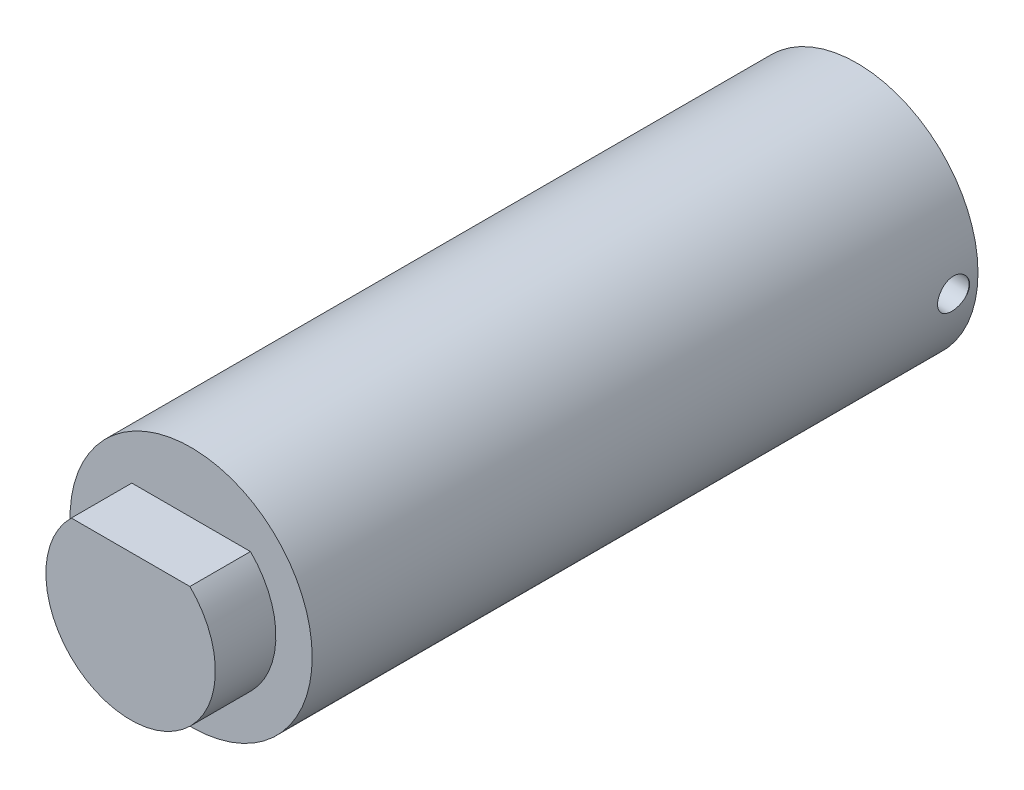
ISO-10303-21;
HEADER;
FILE_DESCRIPTION(('STEP AP214'),'2;1');
FILE_NAME('part.step','',(''),(''),'','','');
FILE_SCHEMA(('AUTOMOTIVE_DESIGN { 1 0 10303 214 1 1 1 1 }'));
ENDSEC;
DATA;
#1=APPLICATION_CONTEXT('core data for automotive mechanical design processes');
#2=APPLICATION_PROTOCOL_DEFINITION('international standard','automotive_design',2000,#1);
#3=PRODUCT_CONTEXT('',#1,'mechanical');
#4=PRODUCT('Part','Part','',(#3));
#5=PRODUCT_RELATED_PRODUCT_CATEGORY('part','',(#4));
#6=PRODUCT_DEFINITION_FORMATION('','',#4);
#7=PRODUCT_DEFINITION_CONTEXT('part definition',#1,'design');
#8=PRODUCT_DEFINITION('design','',#6,#7);
#9=PRODUCT_DEFINITION_SHAPE('','',#8);
#10=(LENGTH_UNIT() NAMED_UNIT(*) SI_UNIT(.MILLI.,.METRE.));
#11=(NAMED_UNIT(*) PLANE_ANGLE_UNIT() SI_UNIT($,.RADIAN.));
#12=(NAMED_UNIT(*) SI_UNIT($,.STERADIAN.) SOLID_ANGLE_UNIT());
#13=UNCERTAINTY_MEASURE_WITH_UNIT(LENGTH_MEASURE(1.E-05),#10,'distance_accuracy_value','');
#14=(GEOMETRIC_REPRESENTATION_CONTEXT(3) GLOBAL_UNCERTAINTY_ASSIGNED_CONTEXT((#13)) GLOBAL_UNIT_ASSIGNED_CONTEXT((#10,
#11,#12)) REPRESENTATION_CONTEXT('',''));
#15=CARTESIAN_POINT('',(0.,0.,0.));
#16=DIRECTION('',(0.,0.,1.));
#17=DIRECTION('',(1.,0.,0.));
#18=AXIS2_PLACEMENT_3D('',#15,#16,#17);
#19=CARTESIAN_POINT('',(0.,0.,60.));
#20=DIRECTION('',(0.,0.,-1.));
#21=DIRECTION('',(-1.,0.,0.));
#22=AXIS2_PLACEMENT_3D('',#19,#20,#21);
#23=CYLINDRICAL_SURFACE('',#22,10.);
#24=CARTESIAN_POINT('',(-10.,0.,3.17520873643316));
#25=CARTESIAN_POINT('',(-9.99999941187946,-0.0662433170421983,3.14392640580855));
#26=CARTESIAN_POINT('',(-9.99933636283552,-0.129891366730712,3.10703901996945));
#27=CARTESIAN_POINT('',(-9.99705258401728,-0.25014696655455,3.02310705172579));
#28=CARTESIAN_POINT('',(-9.99543078797547,-0.306746592828572,2.97605119751558));
#29=CARTESIAN_POINT('',(-9.99167795365727,-0.411225653924768,2.87314766504507));
#30=CARTESIAN_POINT('',(-9.98954716880633,-0.459109407538856,2.8173043667585));
#31=CARTESIAN_POINT('',(-9.9852408485209,-0.544804762138996,2.69838257042104));
#32=CARTESIAN_POINT('',(-9.98306532390359,-0.582618767652236,2.63530580478564));
#33=CARTESIAN_POINT('',(-9.97909450596949,-0.647086451779091,2.50367065039214));
#34=CARTESIAN_POINT('',(-9.97729921622944,-0.673740025412321,2.43511221007799));
#35=CARTESIAN_POINT('',(-9.97442179253287,-0.715082786142368,2.29446157509235));
#36=CARTESIAN_POINT('',(-9.97333964734461,-0.729772161671254,2.22236943609436));
#37=CARTESIAN_POINT('',(-9.9720886889472,-0.74667237446653,2.07726328567874));
#38=CARTESIAN_POINT('',(-9.97191327028684,-0.74897346481107,2.00425983647181));
#39=CARTESIAN_POINT('',(-9.97248885100967,-0.741269479901278,1.85891054708878));
#40=CARTESIAN_POINT('',(-9.97323982712879,-0.731264713677592,1.78656469044486));
#41=CARTESIAN_POINT('',(-9.97553057154206,-0.699315451498621,1.64485848382866));
#42=CARTESIAN_POINT('',(-9.97706739926419,-0.677415447368808,1.57548804163908));
#43=CARTESIAN_POINT('',(-9.980652733918,-0.622356491162161,1.44138400912855));
#44=CARTESIAN_POINT('',(-9.9827012592438,-0.589197134327282,1.37665058560329));
#45=CARTESIAN_POINT('',(-9.98693997538907,-0.512360373952198,1.25325476394668));
#46=CARTESIAN_POINT('',(-9.98913090302228,-0.468624448082806,1.19462883678929));
#47=CARTESIAN_POINT('',(-9.99319590400158,-0.371979727520631,1.08548556412126));
#48=CARTESIAN_POINT('',(-9.99506996371703,-0.319070538422035,1.03496856743521));
#49=CARTESIAN_POINT('',(-9.99805714105313,-0.205208603724033,0.943158287671727));
#50=CARTESIAN_POINT('',(-9.99916545816821,-0.144207921815275,0.901924266967281));
#51=CARTESIAN_POINT('',(-10.0001916727002,-0.016149036171561,0.830261696801887));
#52=CARTESIAN_POINT('',(-10.0001095946572,0.0509090426613417,0.799832924603108));
#53=CARTESIAN_POINT('',(-9.99845178406014,0.188971851173674,0.750740525859519));
#54=CARTESIAN_POINT('',(-9.99688029401258,0.259964831890185,0.732043732769723));
#55=CARTESIAN_POINT('',(-9.9920945148386,0.404027707008825,0.706838485676164));
#56=CARTESIAN_POINT('',(-9.98888030897354,0.477097495970263,0.700329414013289));
#57=CARTESIAN_POINT('',(-9.98086012741732,0.62266028780857,0.699697342998845));
#58=CARTESIAN_POINT('',(-9.97606607059783,0.695153568720002,0.705483314808619));
#59=CARTESIAN_POINT('',(-9.96507991156896,0.838044695741493,0.729083043309526));
#60=CARTESIAN_POINT('',(-9.95888781293385,0.908442547208252,0.746896769250474));
#61=CARTESIAN_POINT('',(-9.94547181997115,1.04513560609381,0.794015499947084));
#62=CARTESIAN_POINT('',(-9.93824842229496,1.1114327664175,0.823314985197033));
#63=CARTESIAN_POINT('',(-9.92325950839722,1.2381422421821,0.892564868690224));
#64=CARTESIAN_POINT('',(-9.91549396648841,1.29855427845558,0.932515771859785));
#65=CARTESIAN_POINT('',(-9.89994125045513,1.41226246391155,1.02227195859742));
#66=CARTESIAN_POINT('',(-9.89215431838212,1.46550467037847,1.0721456303354));
#67=CARTESIAN_POINT('',(-9.87723447819751,1.56290524462446,1.18017566868471));
#68=CARTESIAN_POINT('',(-9.87010158764625,1.60706336854498,1.23833225757672));
#69=CARTESIAN_POINT('',(-9.85705834113824,1.68522477366879,1.36155128450857));
#70=CARTESIAN_POINT('',(-9.85115274000829,1.71918877791369,1.42663915636274));
#71=CARTESIAN_POINT('',(-9.84111199134905,1.7757661227198,1.56170170513952));
#72=CARTESIAN_POINT('',(-9.83697677320621,1.79837991600205,1.63167618702514));
#73=CARTESIAN_POINT('',(-9.83086315027874,1.83150613190975,1.77411550995424));
#74=CARTESIAN_POINT('',(-9.82887293436511,1.84208484200396,1.84656442333078));
#75=CARTESIAN_POINT('',(-9.82718791279291,1.85105365856801,1.99223773074678));
#76=CARTESIAN_POINT('',(-9.82749300806435,1.84944429109842,2.06546209118025));
#77=CARTESIAN_POINT('',(-9.83036155412294,1.83413468037774,2.21012194562162));
#78=CARTESIAN_POINT('',(-9.8329108022337,1.82051047504413,2.28156578899764));
#79=CARTESIAN_POINT('',(-9.84002220789699,1.78167036264875,2.4211239063328));
#80=CARTESIAN_POINT('',(-9.84458440862427,1.75645420695688,2.48923810884143));
#81=CARTESIAN_POINT('',(-9.85534107397195,1.69505791958804,2.62042575402136));
#82=CARTESIAN_POINT('',(-9.86154010941462,1.65884704228475,2.68348442617049));
#83=CARTESIAN_POINT('',(-9.87503987534306,1.57649073116797,2.80261001964597));
#84=CARTESIAN_POINT('',(-9.88234066221382,1.53034478885009,2.85867658286459));
#85=CARTESIAN_POINT('',(-9.89750570179512,1.42899261504033,2.96266905289966));
#86=CARTESIAN_POINT('',(-9.90537378282028,1.37372078756001,3.01053049387105));
#87=CARTESIAN_POINT('',(-9.92100194573648,1.25588478622615,3.0962468848199));
#88=CARTESIAN_POINT('',(-9.92876203067096,1.19332081833903,3.13410211732397));
#89=CARTESIAN_POINT('',(-9.94360135183192,1.06259885889872,3.1987381783688));
#90=CARTESIAN_POINT('',(-9.95068027316997,0.994438306882709,3.22551390376969));
#91=CARTESIAN_POINT('',(-9.96367628934014,0.854453983079347,3.26717818606488));
#92=CARTESIAN_POINT('',(-9.96959319908839,0.782629630017385,3.2820648504394));
#93=CARTESIAN_POINT('',(-9.97989605300074,0.637890977675351,3.2994380912197));
#94=CARTESIAN_POINT('',(-9.98429207943078,0.564987333358729,3.30200783990822));
#95=CARTESIAN_POINT('',(-9.99145036231589,0.419753202285472,3.29488952103383));
#96=CARTESIAN_POINT('',(-9.99421433206001,0.347422193397614,3.28521434153661));
#97=CARTESIAN_POINT('',(-9.99749692886973,0.228782763527017,3.25909579296068));
#98=CARTESIAN_POINT('',(-9.9984550448465,0.181739365997311,3.24592474906565));
#99=CARTESIAN_POINT('',(-9.99970677542979,0.0894133784123451,3.21440123685603));
#100=CARTESIAN_POINT('',(-10.0000003918013,0.0441307836804142,3.19604878230427));
#101=CARTESIAN_POINT('',(-10.,0.,3.17520873643316));
#102=B_SPLINE_CURVE_WITH_KNOTS('',3,(#24,#25,#26,#27,#28,#29,#30,#31,#32,#33,#34,#35,#36,#37,
#38,#39,#40,#41,#42,#43,#44,#45,#46,#47,#48,#49,#50,#51,#52,#53,#54,#55,#56,#57,#58,#59,#60,#61,
#62,#63,#64,#65,#66,#67,#68,#69,#70,#71,#72,#73,#74,#75,#76,#77,#78,#79,#80,#81,#82,#83,#84,#85,
#86,#87,#88,#89,#90,#91,#92,#93,#94,#95,#96,#97,#98,#99,#100,#101),.UNSPECIFIED.,.T.,.F.,(4,2,2,
2,2,2,2,2,2,2,2,2,2,2,2,2,2,2,2,2,2,2,2,2,2,2,2,2,2,2,2,2,2,2,2,2,2,2,4),(0.,0.219596322308999,
0.439437328665767,0.659169103542997,0.878848362135122,1.0985296870895,1.31820755207049,
1.53628279777127,1.75435256717238,1.97161225000845,2.18887974385446,2.40737809558718,
2.62588584401966,2.84575130120144,3.06561222584533,3.28484876523283,3.50407419367453,
3.72168219977831,3.93928964954707,4.15679265553784,4.37430597400775,4.59337385055163,
4.81244760711763,5.03235490715652,5.25225343514898,5.47093483994062,5.68960680608162,
5.90690472240653,6.124207299666,6.34212322728039,6.56005031109348,6.77961808697564,
6.99917966267079,7.21884225455521,7.43853980571747,7.65675169764788,7.8747341074824,
8.02102786163645,8.16732122720961),.UNSPECIFIED.);
#103=CARTESIAN_POINT('',(-10.,0.,3.17520873643316));
#104=VERTEX_POINT('',#103);
#105=EDGE_CURVE('E54',#104,#104,#102,.T.);
#106=ORIENTED_EDGE('',*,*,#105,.T.);
#107=EDGE_LOOP('',(#106));
#108=FACE_BOUND('',#107,.T.);
#109=CARTESIAN_POINT('',(9.92030790761923,-1.25995675244324,0.908842357860262));
#110=CARTESIAN_POINT('',(9.91642507020085,-1.29053186759439,0.928753300924202));
#111=CARTESIAN_POINT('',(9.91250738426814,-1.32024298393703,0.949951277393107));
#112=CARTESIAN_POINT('',(9.90467618166283,-1.37776285655369,0.994785506428262));
#113=CARTESIAN_POINT('',(9.90076266478702,-1.40557171015072,1.01842163409913));
#114=CARTESIAN_POINT('',(9.88914899987093,-1.48581572305187,1.09271998197902));
#115=CARTESIAN_POINT('',(9.88156486765142,-1.53515172667273,1.1468266059941));
#116=CARTESIAN_POINT('',(9.86734169470781,-1.62407121613566,1.26264234426558));
#117=CARTESIAN_POINT('',(9.86070310644059,-1.66365003959749,1.32435507198556));
#118=CARTESIAN_POINT('',(9.84893799556353,-1.73194234291115,1.4536474959404));
#119=CARTESIAN_POINT('',(9.84381103686963,-1.7606589570366,1.52122549283078));
#120=CARTESIAN_POINT('',(9.83553132166988,-1.80634038595019,1.66014112767477));
#121=CARTESIAN_POINT('',(9.83237293470389,-1.82333873196454,1.73146740447137));
#122=CARTESIAN_POINT('',(9.82828981330383,-1.84522233662178,1.87603167776489));
#123=CARTESIAN_POINT('',(9.82736543244546,-1.85010567782845,1.94926997502306));
#124=CARTESIAN_POINT('',(9.82783349813002,-1.84761727159083,2.09498524217048));
#125=CARTESIAN_POINT('',(9.82920883474485,-1.84033602915424,2.16746383310502));
#126=CARTESIAN_POINT('',(9.83412030770654,-1.8139063053651,2.31013476605431));
#127=CARTESIAN_POINT('',(9.83765608286683,-1.79475980766277,2.38032748815968));
#128=CARTESIAN_POINT('',(9.8465775466889,-1.74514787687734,2.51647825860996));
#129=CARTESIAN_POINT('',(9.85196362054303,-1.71468008683702,2.58243542180649));
#130=CARTESIAN_POINT('',(9.86412488813292,-1.64327375250799,2.70828995485394));
#131=CARTESIAN_POINT('',(9.87090026856504,-1.60233380077672,2.76818650865694));
#132=CARTESIAN_POINT('',(9.88473693826456,-1.51452560316755,2.87605492114388));
#133=CARTESIAN_POINT('',(9.89173898811333,-1.46832934339026,2.92458349762));
#134=CARTESIAN_POINT('',(9.90597111922014,-1.36904171087645,3.01392546374391));
#135=CARTESIAN_POINT('',(9.91320117002783,-1.31595125595681,3.05473987859703));
#136=CARTESIAN_POINT('',(9.92030790761923,-1.25995675244324,3.09115764213974));
#137=B_SPLINE_CURVE_WITH_KNOTS('',3,(#109,#110,#111,#112,#113,#114,#115,#116,#117,#118,#119,
#120,#121,#122,#123,#124,#125,#126,#127,#128,#129,#130,#131,#132,#133,#134,#135,#136),
.UNSPECIFIED.,.F.,.F.,(4,2,2,2,2,2,2,2,2,2,2,2,2,4),(0.,0.110010231197419,0.220014829867564,
0.439727306736397,0.659544568607131,0.879298354075111,1.09842068568989,1.31757769548315,
1.53511141858782,1.75260878390323,1.970151454953,2.18772337878175,2.38903014774453,
2.59031014437327),.UNSPECIFIED.);
#138=CARTESIAN_POINT('',(9.92030790761922,-1.25995675244339,0.908842357860253));
#139=VERTEX_POINT('',#138);
#140=CARTESIAN_POINT('',(9.92030790761923,-1.25995675244324,3.09115764213974));
#141=VERTEX_POINT('',#140);
#142=EDGE_CURVE('E63',#139,#141,#137,.T.);
#143=ORIENTED_EDGE('',*,*,#142,.T.);
#144=CARTESIAN_POINT('',(9.84112162747085,-1.77547891631716,1.75729613212786));
#145=CARTESIAN_POINT('',(9.83870187839933,-1.78889589121932,1.83425561713675));
#146=CARTESIAN_POINT('',(9.83741411905284,-1.7959085214737,1.91242444344527));
#147=CARTESIAN_POINT('',(9.83722365538213,-1.796949460704,2.06891763227625));
#148=CARTESIAN_POINT('',(9.83832388427163,-1.79096180116094,2.14724206788276));
#149=CARTESIAN_POINT('',(9.84279330304227,-1.76623179888494,2.3009326282756));
#150=CARTESIAN_POINT('',(9.84613807838503,-1.74762667686533,2.37632144560045));
#151=CARTESIAN_POINT('',(9.85478807610367,-1.69816911762782,2.52283799536986));
#152=CARTESIAN_POINT('',(9.86009279138173,-1.66731984820108,2.59396682447971));
#153=CARTESIAN_POINT('',(9.87220110235642,-1.59405681019271,2.72974097468138));
#154=CARTESIAN_POINT('',(9.87900252549271,-1.55165978287671,2.79439549768758));
#155=CARTESIAN_POINT('',(9.89352134038225,-1.45621321657557,2.91520374531091));
#156=CARTESIAN_POINT('',(9.90123862741716,-1.40316489496258,2.9713584401167));
#157=CARTESIAN_POINT('',(9.91658597063835,-1.29012946443856,3.07097813765436));
#158=CARTESIAN_POINT('',(9.92420649624951,-1.23051879202062,3.11487100135254));
#159=CARTESIAN_POINT('',(9.93903972993441,-1.10431511515401,3.19119658952293));
#160=CARTESIAN_POINT('',(9.94625262432875,-1.0377253411091,3.22363458597399));
#161=CARTESIAN_POINT('',(9.9592746959458,-0.903923703741134,3.27400000848012));
#162=CARTESIAN_POINT('',(9.96514346099709,-0.837011388112895,3.29270827762781));
#163=CARTESIAN_POINT('',(9.97564386619167,-0.700844515015437,3.31800337070767));
#164=CARTESIAN_POINT('',(9.98027594408756,-0.631590796142899,3.32459448864724));
#165=CARTESIAN_POINT('',(9.98789148837806,-0.496372223723747,3.32535019699468));
#166=CARTESIAN_POINT('',(9.99094507566208,-0.430413854779419,3.32011240922813));
#167=CARTESIAN_POINT('',(9.99570305792089,-0.300268281763199,3.29864656670684));
#168=CARTESIAN_POINT('',(9.99740752693235,-0.236080980685557,3.28241911513165));
#169=CARTESIAN_POINT('',(9.99957253080034,-0.111465534423173,3.23968490274023));
#170=CARTESIAN_POINT('',(10.0000373163718,-0.051025239519756,3.21321362521997));
#171=CARTESIAN_POINT('',(9.99995792045217,0.0648285017142996,3.15093777751921));
#172=CARTESIAN_POINT('',(9.99941357438368,0.120241126545713,3.11513168575992));
#173=CARTESIAN_POINT('',(9.99757192121723,0.226999831423517,3.03364931033472));
#174=CARTESIAN_POINT('',(9.99624384121187,0.278076025955523,2.98762058584933));
#175=CARTESIAN_POINT('',(9.99317802130625,0.372318935942867,2.88809326205167));
#176=CARTESIAN_POINT('',(9.99144017205711,0.415483534677022,2.8345926703924));
#177=CARTESIAN_POINT('',(9.9878056576229,0.495418314301563,2.71816262367319));
#178=CARTESIAN_POINT('',(9.98590575007688,0.531642505192331,2.65485825993186));
#179=CARTESIAN_POINT('',(9.98241899037876,0.59352728784107,2.52327455116891));
#180=CARTESIAN_POINT('',(9.98083221503776,0.619185289393839,2.45499399110051));
#181=CARTESIAN_POINT('',(9.97818992287415,0.660438387851583,2.31179802666823));
#182=CARTESIAN_POINT('',(9.9771643243036,0.675477392244543,2.23672146373901));
#183=CARTESIAN_POINT('',(9.97595681753525,0.693082691719316,2.08511034451187));
#184=CARTESIAN_POINT('',(9.97577504016275,0.695647052746189,2.00857556397997));
#185=CARTESIAN_POINT('',(9.97629438038086,0.688161425625093,1.85433458898787));
#186=CARTESIAN_POINT('',(9.97701613229705,0.677816642580072,1.77664255444528));
#187=CARTESIAN_POINT('',(9.97924137663793,0.644222026038059,1.62410197776085));
#188=CARTESIAN_POINT('',(9.98074491837892,0.620971378416367,1.54925361532115));
#189=CARTESIAN_POINT('',(9.98422996123512,0.562150799536995,1.40482594517868));
#190=CARTESIAN_POINT('',(9.98621001823585,0.526617951073755,1.33523153656894));
#191=CARTESIAN_POINT('',(9.99022314208316,0.444009781669548,1.20325087510685));
#192=CARTESIAN_POINT('',(9.99225620335076,0.396935671156475,1.14086386736339));
#193=CARTESIAN_POINT('',(9.99580405041272,0.294042199992013,1.02728067832593));
#194=CARTESIAN_POINT('',(9.99733311487408,0.238544133080217,0.97579444238686));
#195=CARTESIAN_POINT('',(9.99946643218835,0.11923776744409,0.883534187824395));
#196=CARTESIAN_POINT('',(10.0000710478457,0.0554327395008185,0.842755971993138));
#197=CARTESIAN_POINT('',(9.99992007759185,-0.0746840802996298,0.77564294726257));
#198=CARTESIAN_POINT('',(9.99924172097778,-0.140632980555455,0.748604804346062));
#199=CARTESIAN_POINT('',(9.9964128854401,-0.276256540509083,0.706693806335169));
#200=CARTESIAN_POINT('',(9.99426303566891,-0.345929596172484,0.691815758026812));
#201=CARTESIAN_POINT('',(9.98856707840148,-0.482633611453888,0.67538678819662));
#202=CARTESIAN_POINT('',(9.98510969711876,-0.549581736678561,0.67310934236925));
#203=CARTESIAN_POINT('',(9.97688537501593,-0.682795129676097,0.68002287090702));
#204=CARTESIAN_POINT('',(9.97211862734318,-0.749060496669423,0.689212154498828));
#205=CARTESIAN_POINT('',(9.96161645105304,-0.877656236554694,0.718373795225498));
#206=CARTESIAN_POINT('',(9.95590261384801,-0.940039142685556,0.738123825701551));
#207=CARTESIAN_POINT('',(9.94377451420479,-1.06067328075615,0.78751485723312));
#208=CARTESIAN_POINT('',(9.93736020508511,-1.11892423690342,0.817156517766696));
#209=CARTESIAN_POINT('',(9.92404111271383,-1.23155244191704,0.886316771442836));
#210=CARTESIAN_POINT('',(9.91712746672659,-1.28576628089953,0.926099202600828));
#211=CARTESIAN_POINT('',(9.90344951403372,-1.38719614970874,1.01379566151615));
#212=CARTESIAN_POINT('',(9.89668527778588,-1.43440893554743,1.0617134369235));
#213=CARTESIAN_POINT('',(9.88338317557776,-1.52344484787564,1.16730770454779));
#214=CARTESIAN_POINT('',(9.87688183404353,-1.56478968116602,1.22539163583227));
#215=CARTESIAN_POINT('',(9.86504381787976,-1.63776735383337,1.34741872445638));
#216=CARTESIAN_POINT('',(9.85970626367073,-1.66940753530275,1.41135740456802));
#217=CARTESIAN_POINT('',(9.85202791528299,-1.71402443116119,1.52242628397827));
#218=CARTESIAN_POINT('',(9.84927364144824,-1.72973751228012,1.56845183583396));
#219=CARTESIAN_POINT('',(9.84457380684527,-1.75628783028654,1.66192730600419));
#220=CARTESIAN_POINT('',(9.84262828474821,-1.76712483402227,1.70937729231299));
#221=CARTESIAN_POINT('',(9.84112162747085,-1.77547891631716,1.75729613212786));
#222=B_SPLINE_CURVE_WITH_KNOTS('',3,(#144,#145,#146,#147,#148,#149,#150,#151,#152,#153,#154,
#155,#156,#157,#158,#159,#160,#161,#162,#163,#164,#165,#166,#167,#168,#169,#170,#171,#172,#173,
#174,#175,#176,#177,#178,#179,#180,#181,#182,#183,#184,#185,#186,#187,#188,#189,#190,#191,#192,
#193,#194,#195,#196,#197,#198,#199,#200,#201,#202,#203,#204,#205,#206,#207,#208,#209,#210,#211,
#212,#213,#214,#215,#216,#217,#218,#219,#220,#221),.UNSPECIFIED.,.T.,.F.,(4,2,2,2,2,2,2,2,2,2,2,
2,2,2,2,2,2,2,2,2,2,2,2,2,2,2,2,2,2,2,2,2,2,2,2,2,2,2,4),(0.,0.234296334923403,
0.468880623573985,0.700953766408602,0.932966906654724,1.16464546183363,1.39629755275099,
1.61839509058412,1.84039027679402,2.0484971014719,2.25653016420585,2.45428928981611,
2.65203756208315,2.8491069040332,3.04620838847767,3.25161845243394,3.45708339320505,
3.67499902041629,3.89296803590704,4.1216418821681,4.35035118064024,4.58438021689549,
4.81842401779311,5.05176727115161,5.28508606232829,5.51107306709492,5.73697135937628,
5.94970248423501,6.16234271042873,6.36258377971276,6.56279532686847,6.75894897845965,
6.95511571028952,7.15702749968054,7.35903255594801,7.57288125391199,7.78656776245103,
7.93244545108086,8.07833011417481),.UNSPECIFIED.);
#223=CARTESIAN_POINT('',(9.99885704132279,0.151188184689226,3.09115764213974));
#224=VERTEX_POINT('',#223);
#225=EDGE_CURVE('E13',#141,#224,#222,.T.);
#226=ORIENTED_EDGE('',*,*,#225,.T.);
#227=CARTESIAN_POINT('',(9.99885704132279,0.151188184689226,3.09115764213973));
#228=CARTESIAN_POINT('',(9.99839150706598,0.182005345018814,3.07124669907579));
#229=CARTESIAN_POINT('',(9.99779545044931,0.211967711646014,3.05004872260689));
#230=CARTESIAN_POINT('',(9.99639635120438,0.270001374303001,3.00521449357173));
#231=CARTESIAN_POINT('',(9.99559331917538,0.298072767077116,2.98157836590086));
#232=CARTESIAN_POINT('',(9.99295711641454,0.379109976149661,2.90728001802098));
#233=CARTESIAN_POINT('',(9.99089529138148,0.428982906606309,2.85317339400589));
#234=CARTESIAN_POINT('',(9.98662853122446,0.5189316087242,2.73735765573441));
#235=CARTESIAN_POINT('',(9.98442352831758,0.559002696592953,2.67564492801443));
#236=CARTESIAN_POINT('',(9.98031037930153,0.628178837935223,2.54635250405959));
#237=CARTESIAN_POINT('',(9.97840214765321,0.657287054717691,2.47877450716921));
#238=CARTESIAN_POINT('',(9.9752434412857,0.703605185136145,2.33985887232522));
#239=CARTESIAN_POINT('',(9.97399109228372,0.720849047737885,2.26853259552862));
#240=CARTESIAN_POINT('',(9.97236190194078,0.743050619123449,2.1239683222351));
#241=CARTESIAN_POINT('',(9.97198519918854,0.748006383075504,2.05073002497693));
#242=CARTESIAN_POINT('',(9.9721742026664,0.745481402130264,1.90501475782951));
#243=CARTESIAN_POINT('',(9.97273294918014,0.738092502039052,1.83253616689497));
#244=CARTESIAN_POINT('',(9.9746808321153,0.711280963137029,1.68986523394568));
#245=CARTESIAN_POINT('',(9.97606982973277,0.691860335807614,1.61967251184031));
#246=CARTESIAN_POINT('',(9.97943010154209,0.641564761784109,1.48352174139003));
#247=CARTESIAN_POINT('',(9.98140149696463,0.610687429943562,1.4175645781935));
#248=CARTESIAN_POINT('',(9.98556275104021,0.538372528462461,1.29171004514606));
#249=CARTESIAN_POINT('',(9.98775263903418,0.496933539353985,1.23181349134305));
#250=CARTESIAN_POINT('',(9.99175861808202,0.408132159141668,1.12394507885612));
#251=CARTESIAN_POINT('',(9.99359041467372,0.361444177382522,1.07541650238));
#252=CARTESIAN_POINT('',(9.99671539064452,0.261190389168709,0.986074536256089));
#253=CARTESIAN_POINT('',(9.99800864162338,0.207625498240404,0.945260121402971));
#254=CARTESIAN_POINT('',(9.99885704132279,0.151188184689226,0.908842357860267));
#255=B_SPLINE_CURVE_WITH_KNOTS('',3,(#227,#228,#229,#230,#231,#232,#233,#234,#235,#236,#237,
#238,#239,#240,#241,#242,#243,#244,#245,#246,#247,#248,#249,#250,#251,#252,#253,#254),
.UNSPECIFIED.,.F.,.F.,(4,2,2,2,2,2,2,2,2,2,2,2,2,4),(0.,0.11001023119742,0.220014829867564,
0.439727306736398,0.659544568607132,0.879298354075111,1.09842068568989,1.31757769548315,
1.53511141858782,1.75260878390323,1.970151454953,2.18772337878175,2.38903014774452,
2.59031014437325),.UNSPECIFIED.);
#256=CARTESIAN_POINT('',(9.99885704132279,0.151188184689226,0.908842357860265));
#257=VERTEX_POINT('',#256);
#258=EDGE_CURVE('E98',#224,#257,#255,.T.);
#259=ORIENTED_EDGE('',*,*,#258,.T.);
#260=EDGE_CURVE('E65',#257,#139,#222,.T.);
#261=ORIENTED_EDGE('',*,*,#260,.T.);
#262=EDGE_LOOP('',(#143,#226,#259,#261));
#263=FACE_BOUND('',#262,.T.);
#264=CARTESIAN_POINT('',(0.,0.,0.));
#265=DIRECTION('',(0.,0.,1.));
#266=DIRECTION('',(1.,0.,0.));
#267=AXIS2_PLACEMENT_3D('',#264,#265,#266);
#268=CIRCLE('',#267,10.);
#269=CARTESIAN_POINT('',(10.,0.,0.));
#270=VERTEX_POINT('',#269);
#271=EDGE_CURVE('E149',#270,#270,#268,.T.);
#272=ORIENTED_EDGE('',*,*,#271,.T.);
#273=EDGE_LOOP('',(#272));
#274=FACE_BOUND('',#273,.T.);
#275=CARTESIAN_POINT('',(0.,0.,55.));
#276=DIRECTION('',(0.,0.,1.));
#277=DIRECTION('',(1.,0.,0.));
#278=AXIS2_PLACEMENT_3D('',#275,#276,#277);
#279=CIRCLE('',#278,10.);
#280=CARTESIAN_POINT('',(10.,0.,55.));
#281=VERTEX_POINT('',#280);
#282=EDGE_CURVE('E150',#281,#281,#279,.T.);
#283=ORIENTED_EDGE('',*,*,#282,.F.);
#284=EDGE_LOOP('',(#283));
#285=FACE_BOUND('',#284,.T.);
#286=ADVANCED_FACE('F50',(#108,#263,#274,#285),#23,.T.);
#287=CARTESIAN_POINT('',(0.,0.,0.));
#288=DIRECTION('',(0.,0.,1.));
#289=DIRECTION('',(1.,0.,0.));
#290=AXIS2_PLACEMENT_3D('',#287,#288,#289);
#291=PLANE('',#290);
#292=ORIENTED_EDGE('',*,*,#271,.F.);
#293=EDGE_LOOP('',(#292));
#294=FACE_BOUND('',#293,.T.);
#295=ADVANCED_FACE('F137',(#294),#291,.F.);
#296=CARTESIAN_POINT('',(0.,0.,55.));
#297=DIRECTION('',(0.,0.,1.));
#298=DIRECTION('',(1.,0.,0.));
#299=AXIS2_PLACEMENT_3D('',#296,#297,#298);
#300=PLANE('',#299);
#301=CARTESIAN_POINT('',(0.,0.,55.));
#302=DIRECTION('',(0.,0.,1.));
#303=DIRECTION('',(1.,0.,0.));
#304=AXIS2_PLACEMENT_3D('',#301,#302,#303);
#305=CIRCLE('',#304,7.);
#306=CARTESIAN_POINT('',(-4.89897948556635,5.,55.));
#307=VERTEX_POINT('',#306);
#308=CARTESIAN_POINT('',(4.89897948556635,5.,55.));
#309=VERTEX_POINT('',#308);
#310=EDGE_CURVE('E153',#307,#309,#305,.T.);
#311=ORIENTED_EDGE('',*,*,#310,.F.);
#312=DIRECTION('',(1.,0.,0.));
#313=VECTOR('',#312,1.);
#314=CARTESIAN_POINT('',(-4.89897948556635,5.,55.));
#315=LINE('',#314,#313);
#316=EDGE_CURVE('E166',#307,#309,#315,.T.);
#317=ORIENTED_EDGE('',*,*,#316,.T.);
#318=EDGE_LOOP('',(#311,#317));
#319=FACE_BOUND('',#318,.T.);
#320=ORIENTED_EDGE('',*,*,#282,.T.);
#321=EDGE_LOOP('',(#320));
#322=FACE_BOUND('',#321,.T.);
#323=ADVANCED_FACE('F133',(#319,#322),#300,.T.);
#324=CARTESIAN_POINT('',(0.,0.,55.));
#325=DIRECTION('',(0.,0.,1.));
#326=DIRECTION('',(1.,0.,0.));
#327=AXIS2_PLACEMENT_3D('',#324,#325,#326);
#328=CYLINDRICAL_SURFACE('',#327,7.);
#329=DIRECTION('',(0.,0.,1.));
#330=VECTOR('',#329,1.);
#331=CARTESIAN_POINT('',(4.89897948556635,5.,55.));
#332=LINE('',#331,#330);
#333=CARTESIAN_POINT('',(4.89897948556635,5.,60.));
#334=VERTEX_POINT('',#333);
#335=EDGE_CURVE('E162',#309,#334,#332,.T.);
#336=ORIENTED_EDGE('',*,*,#335,.T.);
#337=CARTESIAN_POINT('',(0.,0.,60.));
#338=DIRECTION('',(0.,0.,1.));
#339=DIRECTION('',(1.,0.,0.));
#340=AXIS2_PLACEMENT_3D('',#337,#338,#339);
#341=CIRCLE('',#340,7.);
#342=CARTESIAN_POINT('',(-4.89897948556635,5.,60.));
#343=VERTEX_POINT('',#342);
#344=EDGE_CURVE('E159',#343,#334,#341,.T.);
#345=ORIENTED_EDGE('',*,*,#344,.F.);
#346=DIRECTION('',(0.,0.,1.));
#347=VECTOR('',#346,1.);
#348=CARTESIAN_POINT('',(-4.89897948556635,5.,55.));
#349=LINE('',#348,#347);
#350=EDGE_CURVE('E79',#307,#343,#349,.T.);
#351=ORIENTED_EDGE('',*,*,#350,.F.);
#352=ORIENTED_EDGE('',*,*,#310,.T.);
#353=EDGE_LOOP('',(#336,#345,#351,#352));
#354=FACE_BOUND('',#353,.T.);
#355=ADVANCED_FACE('F130',(#354),#328,.T.);
#356=CARTESIAN_POINT('',(0.,0.,60.));
#357=DIRECTION('',(0.,0.,1.));
#358=DIRECTION('',(1.,0.,0.));
#359=AXIS2_PLACEMENT_3D('',#356,#357,#358);
#360=PLANE('',#359);
#361=DIRECTION('',(1.,0.,0.));
#362=VECTOR('',#361,1.);
#363=CARTESIAN_POINT('',(-4.89897948556635,5.,60.));
#364=LINE('',#363,#362);
#365=EDGE_CURVE('E169',#343,#334,#364,.T.);
#366=ORIENTED_EDGE('',*,*,#365,.F.);
#367=ORIENTED_EDGE('',*,*,#344,.T.);
#368=EDGE_LOOP('',(#366,#367));
#369=FACE_BOUND('',#368,.T.);
#370=ADVANCED_FACE('F129',(#369),#360,.T.);
#371=CARTESIAN_POINT('',(-4.89897948556635,5.,55.));
#372=DIRECTION('',(0.,-1.,0.));
#373=DIRECTION('',(0.,0.,-1.));
#374=AXIS2_PLACEMENT_3D('',#371,#372,#373);
#375=PLANE('',#374);
#376=ORIENTED_EDGE('',*,*,#365,.T.);
#377=ORIENTED_EDGE('',*,*,#335,.F.);
#378=ORIENTED_EDGE('',*,*,#316,.F.);
#379=ORIENTED_EDGE('',*,*,#350,.T.);
#380=EDGE_LOOP('',(#376,#377,#378,#379));
#381=FACE_BOUND('',#380,.T.);
#382=ADVANCED_FACE('F122',(#381),#375,.F.);
#383=CARTESIAN_POINT('',(9.98454383405615,-0.555773718172442,2.));
#384=DIRECTION('',(0.998454383405616,-0.0555773718172438,0.));
#385=DIRECTION('',(0.0555773718172438,0.998454383405616,0.));
#386=AXIS2_PLACEMENT_3D('',#383,#384,#385);
#387=CYLINDRICAL_SURFACE('',#386,1.3);
#388=ORIENTED_EDGE('',*,*,#105,.F.);
#389=EDGE_LOOP('',(#388));
#390=FACE_BOUND('',#389,.T.);
#391=CARTESIAN_POINT('',(9.95958247447101,-0.554384283877011,2.));
#392=DIRECTION('',(0.998454383405616,-0.0555773718172438,0.));
#393=DIRECTION('',(0.0555773718172438,0.998454383405616,0.));
#394=AXIS2_PLACEMENT_3D('',#391,#392,#393);
#395=CIRCLE('',#394,1.3);
#396=EDGE_CURVE('E71',#139,#257,#395,.T.);
#397=ORIENTED_EDGE('',*,*,#396,.T.);
#398=ORIENTED_EDGE('',*,*,#258,.F.);
#399=EDGE_CURVE('E101',#224,#141,#395,.T.);
#400=ORIENTED_EDGE('',*,*,#399,.T.);
#401=ORIENTED_EDGE('',*,*,#142,.F.);
#402=EDGE_LOOP('',(#397,#398,#400,#401));
#403=FACE_BOUND('',#402,.T.);
#404=ADVANCED_FACE('F100',(#390,#403),#387,.F.);
#405=CARTESIAN_POINT('',(9.98454383405615,-0.555773718172442,2.));
#406=DIRECTION('',(0.998454383405616,-0.0555773718172438,0.));
#407=DIRECTION('',(0.0555773718172438,0.998454383405616,0.));
#408=AXIS2_PLACEMENT_3D('',#405,#406,#407);
#409=CONICAL_SURFACE('',#408,1.325,0.785398163397395);
#410=ORIENTED_EDGE('',*,*,#399,.F.);
#411=ORIENTED_EDGE('',*,*,#225,.F.);
#412=EDGE_LOOP('',(#410,#411));
#413=FACE_BOUND('',#412,.T.);
#414=ADVANCED_FACE('F107',(#413),#409,.F.);
#415=ORIENTED_EDGE('',*,*,#396,.F.);
#416=ORIENTED_EDGE('',*,*,#260,.F.);
#417=EDGE_LOOP('',(#415,#416));
#418=FACE_BOUND('',#417,.T.);
#419=ADVANCED_FACE('F203',(#418),#409,.F.);
#420=CLOSED_SHELL('',(#286,#295,#323,#355,#370,#382,#404,#414,#419));
#421=MANIFOLD_SOLID_BREP('B2',#420);
#422=ADVANCED_BREP_SHAPE_REPRESENTATION('',(#18,#421),#14);
#423=SHAPE_DEFINITION_REPRESENTATION(#9,#422);
ENDSEC;
END-ISO-10303-21;
